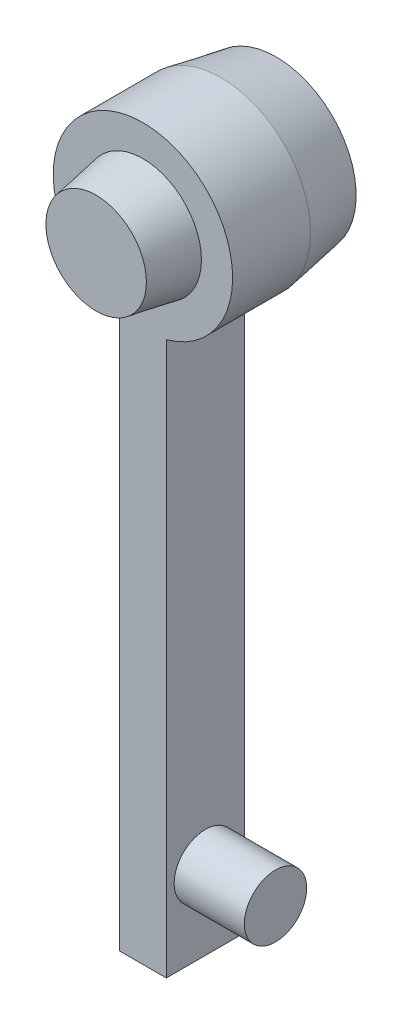
ISO-10303-21;
HEADER;
FILE_DESCRIPTION(('STEP AP214'),'2;1');
FILE_NAME('part.step','',(''),(''),'','','');
FILE_SCHEMA(('AUTOMOTIVE_DESIGN { 1 0 10303 214 1 1 1 1 }'));
ENDSEC;
DATA;
#1=APPLICATION_CONTEXT('core data for automotive mechanical design processes');
#2=APPLICATION_PROTOCOL_DEFINITION('international standard','automotive_design',2000,#1);
#3=PRODUCT_CONTEXT('',#1,'mechanical');
#4=PRODUCT('Part','Part','',(#3));
#5=PRODUCT_RELATED_PRODUCT_CATEGORY('part','',(#4));
#6=PRODUCT_DEFINITION_FORMATION('','',#4);
#7=PRODUCT_DEFINITION_CONTEXT('part definition',#1,'design');
#8=PRODUCT_DEFINITION('design','',#6,#7);
#9=PRODUCT_DEFINITION_SHAPE('','',#8);
#10=(LENGTH_UNIT() NAMED_UNIT(*) SI_UNIT(.MILLI.,.METRE.));
#11=(NAMED_UNIT(*) PLANE_ANGLE_UNIT() SI_UNIT($,.RADIAN.));
#12=(NAMED_UNIT(*) SI_UNIT($,.STERADIAN.) SOLID_ANGLE_UNIT());
#13=UNCERTAINTY_MEASURE_WITH_UNIT(LENGTH_MEASURE(1.E-05),#10,'distance_accuracy_value','');
#14=(GEOMETRIC_REPRESENTATION_CONTEXT(3) GLOBAL_UNCERTAINTY_ASSIGNED_CONTEXT((#13)) GLOBAL_UNIT_ASSIGNED_CONTEXT((#10,
#11,#12)) REPRESENTATION_CONTEXT('',''));
#15=CARTESIAN_POINT('',(0.,0.,0.));
#16=DIRECTION('',(0.,0.,1.));
#17=DIRECTION('',(1.,0.,0.));
#18=AXIS2_PLACEMENT_3D('',#15,#16,#17);
#19=CARTESIAN_POINT('',(3.00000000000001,29.8981983444127,5.));
#20=DIRECTION('',(1.,0.,0.));
#21=DIRECTION('',(0.,1.,0.));
#22=AXIS2_PLACEMENT_3D('',#19,#20,#21);
#23=PLANE('',#22);
#24=CARTESIAN_POINT('',(3.,-31.,0.));
#25=DIRECTION('',(1.,0.,0.));
#26=DIRECTION('',(0.,1.,0.));
#27=AXIS2_PLACEMENT_3D('',#24,#25,#26);
#28=CIRCLE('',#27,4.);
#29=CARTESIAN_POINT('',(3.,-27.,0.));
#30=VERTEX_POINT('',#29);
#31=EDGE_CURVE('E121',#30,#30,#28,.T.);
#32=ORIENTED_EDGE('',*,*,#31,.F.);
#33=EDGE_LOOP('',(#32));
#34=FACE_BOUND('',#33,.T.);
#35=DIRECTION('',(0.,-1.,0.));
#36=VECTOR('',#35,1.);
#37=CARTESIAN_POINT('',(3.00000000000001,29.8981983444127,-5.));
#38=LINE('',#37,#36);
#39=CARTESIAN_POINT('',(3.00000000000001,29.8981983444127,-5.));
#40=VERTEX_POINT('',#39);
#41=CARTESIAN_POINT('',(3.,-41.,-5.));
#42=VERTEX_POINT('',#41);
#43=EDGE_CURVE('E93',#40,#42,#38,.T.);
#44=ORIENTED_EDGE('',*,*,#43,.F.);
#45=DIRECTION('',(0.,0.,-1.));
#46=VECTOR('',#45,1.);
#47=CARTESIAN_POINT('',(3.00000000000001,29.8981983444127,5.));
#48=LINE('',#47,#46);
#49=CARTESIAN_POINT('',(3.00000000000001,29.8981983444127,5.));
#50=VERTEX_POINT('',#49);
#51=EDGE_CURVE('E11',#50,#40,#48,.T.);
#52=ORIENTED_EDGE('',*,*,#51,.F.);
#53=DIRECTION('',(0.,-1.,0.));
#54=VECTOR('',#53,1.);
#55=CARTESIAN_POINT('',(3.00000000000001,29.8981983444127,5.));
#56=LINE('',#55,#54);
#57=CARTESIAN_POINT('',(3.,-41.,5.));
#58=VERTEX_POINT('',#57);
#59=EDGE_CURVE('E85',#50,#58,#56,.T.);
#60=ORIENTED_EDGE('',*,*,#59,.T.);
#61=DIRECTION('',(0.,0.,-1.));
#62=VECTOR('',#61,1.);
#63=CARTESIAN_POINT('',(3.,-41.,5.));
#64=LINE('',#63,#62);
#65=EDGE_CURVE('E37',#58,#42,#64,.T.);
#66=ORIENTED_EDGE('',*,*,#65,.T.);
#67=EDGE_LOOP('',(#44,#52,#60,#66));
#68=FACE_BOUND('',#67,.T.);
#69=ADVANCED_FACE('F34',(#34,#68),#23,.T.);
#70=CARTESIAN_POINT('',(0.,41.,5.));
#71=DIRECTION('',(0.,0.,-1.));
#72=DIRECTION('',(-1.,0.,0.));
#73=AXIS2_PLACEMENT_3D('',#70,#71,#72);
#74=CYLINDRICAL_SURFACE('',#73,11.5);
#75=CARTESIAN_POINT('',(0.,41.,-5.));
#76=DIRECTION('',(0.,0.,1.));
#77=DIRECTION('',(1.,0.,0.));
#78=AXIS2_PLACEMENT_3D('',#75,#76,#77);
#79=CIRCLE('',#78,11.5);
#80=CARTESIAN_POINT('',(-3.00000000000002,29.8981983444127,-5.));
#81=VERTEX_POINT('',#80);
#82=EDGE_CURVE('E80',#40,#81,#79,.T.);
#83=ORIENTED_EDGE('',*,*,#82,.T.);
#84=DIRECTION('',(0.,0.,-1.));
#85=VECTOR('',#84,1.);
#86=CARTESIAN_POINT('',(-3.00000000000002,29.8981983444127,5.));
#87=LINE('',#86,#85);
#88=CARTESIAN_POINT('',(-3.00000000000002,29.8981983444127,5.));
#89=VERTEX_POINT('',#88);
#90=EDGE_CURVE('E43',#89,#81,#87,.T.);
#91=ORIENTED_EDGE('',*,*,#90,.F.);
#92=CARTESIAN_POINT('',(0.,41.,5.));
#93=DIRECTION('',(0.,0.,1.));
#94=DIRECTION('',(1.,0.,0.));
#95=AXIS2_PLACEMENT_3D('',#92,#93,#94);
#96=CIRCLE('',#95,11.5);
#97=EDGE_CURVE('E98',#50,#89,#96,.T.);
#98=ORIENTED_EDGE('',*,*,#97,.F.);
#99=ORIENTED_EDGE('',*,*,#51,.T.);
#100=EDGE_LOOP('',(#83,#91,#98,#99));
#101=FACE_BOUND('',#100,.T.);
#102=ADVANCED_FACE('F97',(#101),#74,.T.);
#103=CARTESIAN_POINT('',(-3.00000000000001,29.8981983444127,5.));
#104=DIRECTION('',(1.,0.,0.));
#105=DIRECTION('',(0.,1.,0.));
#106=AXIS2_PLACEMENT_3D('',#103,#104,#105);
#107=PLANE('',#106);
#108=DIRECTION('',(0.,-1.,0.));
#109=VECTOR('',#108,1.);
#110=CARTESIAN_POINT('',(-3.00000000000001,29.8981983444127,-5.));
#111=LINE('',#110,#109);
#112=CARTESIAN_POINT('',(-3.,-41.,-5.));
#113=VERTEX_POINT('',#112);
#114=EDGE_CURVE('E86',#81,#113,#111,.T.);
#115=ORIENTED_EDGE('',*,*,#114,.T.);
#116=DIRECTION('',(0.,0.,-1.));
#117=VECTOR('',#116,1.);
#118=CARTESIAN_POINT('',(-3.,-41.,5.));
#119=LINE('',#118,#117);
#120=CARTESIAN_POINT('',(-3.,-41.,5.));
#121=VERTEX_POINT('',#120);
#122=EDGE_CURVE('E66',#121,#113,#119,.T.);
#123=ORIENTED_EDGE('',*,*,#122,.F.);
#124=DIRECTION('',(0.,-1.,0.));
#125=VECTOR('',#124,1.);
#126=CARTESIAN_POINT('',(-3.00000000000001,29.8981983444127,5.));
#127=LINE('',#126,#125);
#128=EDGE_CURVE('E111',#89,#121,#127,.T.);
#129=ORIENTED_EDGE('',*,*,#128,.F.);
#130=ORIENTED_EDGE('',*,*,#90,.T.);
#131=EDGE_LOOP('',(#115,#123,#129,#130));
#132=FACE_BOUND('',#131,.T.);
#133=ADVANCED_FACE('F151',(#132),#107,.F.);
#134=CARTESIAN_POINT('',(3.,-41.,5.));
#135=DIRECTION('',(0.,-1.,0.));
#136=DIRECTION('',(0.,0.,-1.));
#137=AXIS2_PLACEMENT_3D('',#134,#135,#136);
#138=PLANE('',#137);
#139=DIRECTION('',(-1.,0.,0.));
#140=VECTOR('',#139,1.);
#141=CARTESIAN_POINT('',(3.,-41.,-5.));
#142=LINE('',#141,#140);
#143=EDGE_CURVE('E100',#42,#113,#142,.T.);
#144=ORIENTED_EDGE('',*,*,#143,.F.);
#145=ORIENTED_EDGE('',*,*,#65,.F.);
#146=DIRECTION('',(-1.,0.,0.));
#147=VECTOR('',#146,1.);
#148=CARTESIAN_POINT('',(3.,-41.,5.));
#149=LINE('',#148,#147);
#150=EDGE_CURVE('E113',#58,#121,#149,.T.);
#151=ORIENTED_EDGE('',*,*,#150,.T.);
#152=ORIENTED_EDGE('',*,*,#122,.T.);
#153=EDGE_LOOP('',(#144,#145,#151,#152));
#154=FACE_BOUND('',#153,.T.);
#155=ADVANCED_FACE('F176',(#154),#138,.T.);
#156=CARTESIAN_POINT('',(0.,41.,5.));
#157=DIRECTION('',(0.,0.,1.));
#158=DIRECTION('',(1.,0.,0.));
#159=AXIS2_PLACEMENT_3D('',#156,#157,#158);
#160=PLANE('',#159);
#161=CARTESIAN_POINT('',(0.,41.,5.));
#162=DIRECTION('',(0.,0.,1.));
#163=DIRECTION('',(1.,0.,0.));
#164=AXIS2_PLACEMENT_3D('',#161,#162,#163);
#165=CIRCLE('',#164,7.5);
#166=CARTESIAN_POINT('',(7.5,41.,5.));
#167=VERTEX_POINT('',#166);
#168=EDGE_CURVE('E105',#167,#167,#165,.T.);
#169=ORIENTED_EDGE('',*,*,#168,.F.);
#170=EDGE_LOOP('',(#169));
#171=FACE_BOUND('',#170,.T.);
#172=ORIENTED_EDGE('',*,*,#59,.F.);
#173=ORIENTED_EDGE('',*,*,#97,.T.);
#174=ORIENTED_EDGE('',*,*,#128,.T.);
#175=ORIENTED_EDGE('',*,*,#150,.F.);
#176=EDGE_LOOP('',(#172,#173,#174,#175));
#177=FACE_BOUND('',#176,.T.);
#178=ADVANCED_FACE('F174',(#171,#177),#160,.T.);
#179=CARTESIAN_POINT('',(0.,41.,-5.));
#180=DIRECTION('',(0.,0.,1.));
#181=DIRECTION('',(1.,0.,0.));
#182=AXIS2_PLACEMENT_3D('',#179,#180,#181);
#183=PLANE('',#182);
#184=CARTESIAN_POINT('',(0.,41.,-5.));
#185=DIRECTION('',(0.,0.,-1.));
#186=DIRECTION('',(-1.,0.,0.));
#187=AXIS2_PLACEMENT_3D('',#184,#185,#186);
#188=CIRCLE('',#187,11.5);
#189=EDGE_CURVE('E73',#40,#81,#188,.T.);
#190=ORIENTED_EDGE('',*,*,#189,.F.);
#191=ORIENTED_EDGE('',*,*,#43,.T.);
#192=ORIENTED_EDGE('',*,*,#143,.T.);
#193=ORIENTED_EDGE('',*,*,#114,.F.);
#194=EDGE_LOOP('',(#190,#191,#192,#193));
#195=FACE_BOUND('',#194,.T.);
#196=ADVANCED_FACE('F91',(#195),#183,.F.);
#197=CARTESIAN_POINT('',(0.,41.,5.));
#198=DIRECTION('',(0.,0.,-1.));
#199=DIRECTION('',(1.,0.,0.));
#200=AXIS2_PLACEMENT_3D('',#197,#198,#199);
#201=CONICAL_SURFACE('',#200,7.5,0.174532925199433);
#202=CARTESIAN_POINT('',(0.,41.,11.));
#203=DIRECTION('',(0.,0.,1.));
#204=DIRECTION('',(1.,0.,0.));
#205=AXIS2_PLACEMENT_3D('',#202,#203,#204);
#206=CIRCLE('',#205,6.44203811574921);
#207=CARTESIAN_POINT('',(6.44203811574921,41.,11.));
#208=VERTEX_POINT('',#207);
#209=EDGE_CURVE('E101',#208,#208,#206,.T.);
#210=ORIENTED_EDGE('',*,*,#209,.F.);
#211=EDGE_LOOP('',(#210));
#212=FACE_BOUND('',#211,.T.);
#213=ORIENTED_EDGE('',*,*,#168,.T.);
#214=EDGE_LOOP('',(#213));
#215=FACE_BOUND('',#214,.T.);
#216=ADVANCED_FACE('F166',(#212,#215),#201,.T.);
#217=CARTESIAN_POINT('',(0.,41.,11.));
#218=DIRECTION('',(0.,0.,1.));
#219=DIRECTION('',(1.,0.,0.));
#220=AXIS2_PLACEMENT_3D('',#217,#218,#219);
#221=PLANE('',#220);
#222=ORIENTED_EDGE('',*,*,#209,.T.);
#223=EDGE_LOOP('',(#222));
#224=FACE_BOUND('',#223,.T.);
#225=ADVANCED_FACE('F157',(#224),#221,.T.);
#226=CARTESIAN_POINT('',(12.,-31.,0.));
#227=DIRECTION('',(-1.,0.,0.));
#228=DIRECTION('',(0.,-1.,0.));
#229=AXIS2_PLACEMENT_3D('',#226,#227,#228);
#230=CYLINDRICAL_SURFACE('',#229,4.);
#231=CARTESIAN_POINT('',(12.,-31.,0.));
#232=DIRECTION('',(1.,0.,0.));
#233=DIRECTION('',(0.,1.,0.));
#234=AXIS2_PLACEMENT_3D('',#231,#232,#233);
#235=CIRCLE('',#234,4.);
#236=CARTESIAN_POINT('',(12.,-27.,0.));
#237=VERTEX_POINT('',#236);
#238=EDGE_CURVE('E120',#237,#237,#235,.T.);
#239=ORIENTED_EDGE('',*,*,#238,.F.);
#240=EDGE_LOOP('',(#239));
#241=FACE_BOUND('',#240,.T.);
#242=ORIENTED_EDGE('',*,*,#31,.T.);
#243=EDGE_LOOP('',(#242));
#244=FACE_BOUND('',#243,.T.);
#245=ADVANCED_FACE('F155',(#241,#244),#230,.T.);
#246=CARTESIAN_POINT('',(12.,-31.,0.));
#247=DIRECTION('',(1.,0.,0.));
#248=DIRECTION('',(0.,1.,0.));
#249=AXIS2_PLACEMENT_3D('',#246,#247,#248);
#250=PLANE('',#249);
#251=ORIENTED_EDGE('',*,*,#238,.T.);
#252=EDGE_LOOP('',(#251));
#253=FACE_BOUND('',#252,.T.);
#254=ADVANCED_FACE('F136',(#253),#250,.T.);
#255=CARTESIAN_POINT('',(0.,41.,-5.));
#256=DIRECTION('',(0.,0.,-1.));
#257=DIRECTION('',(-1.,0.,0.));
#258=AXIS2_PLACEMENT_3D('',#255,#256,#257);
#259=CONICAL_SURFACE('',#258,9.,0.174532925199433);
#260=CARTESIAN_POINT('',(0.,41.,-5.));
#261=DIRECTION('',(0.,0.,-1.));
#262=DIRECTION('',(-1.,0.,0.));
#263=AXIS2_PLACEMENT_3D('',#260,#261,#262);
#264=CIRCLE('',#263,9.);
#265=CARTESIAN_POINT('',(-9.,41.,-5.));
#266=VERTEX_POINT('',#265);
#267=EDGE_CURVE('E95',#266,#266,#264,.T.);
#268=ORIENTED_EDGE('',*,*,#267,.F.);
#269=EDGE_LOOP('',(#268));
#270=FACE_BOUND('',#269,.T.);
#271=CARTESIAN_POINT('',(0.,41.,-12.0891022745221));
#272=DIRECTION('',(0.,0.,-1.));
#273=DIRECTION('',(-1.,0.,0.));
#274=AXIS2_PLACEMENT_3D('',#271,#272,#273);
#275=CIRCLE('',#274,10.25);
#276=CARTESIAN_POINT('',(-10.25,41.,-12.0891022745221));
#277=VERTEX_POINT('',#276);
#278=EDGE_CURVE('E94',#277,#277,#275,.T.);
#279=ORIENTED_EDGE('',*,*,#278,.T.);
#280=EDGE_LOOP('',(#279));
#281=FACE_BOUND('',#280,.T.);
#282=ADVANCED_FACE('F133',(#270,#281),#259,.F.);
#283=CARTESIAN_POINT('',(0.,41.,-5.));
#284=DIRECTION('',(0.,0.,1.));
#285=DIRECTION('',(-1.,0.,0.));
#286=AXIS2_PLACEMENT_3D('',#283,#284,#285);
#287=CONICAL_SURFACE('',#286,11.5,0.174532925199433);
#288=ORIENTED_EDGE('',*,*,#278,.F.);
#289=EDGE_LOOP('',(#288));
#290=FACE_BOUND('',#289,.T.);
#291=ORIENTED_EDGE('',*,*,#189,.T.);
#292=ORIENTED_EDGE('',*,*,#82,.F.);
#293=EDGE_LOOP('',(#291,#292));
#294=FACE_BOUND('',#293,.T.);
#295=ADVANCED_FACE('F81',(#290,#294),#287,.T.);
#296=ORIENTED_EDGE('',*,*,#267,.T.);
#297=EDGE_LOOP('',(#296));
#298=FACE_BOUND('',#297,.T.);
#299=ADVANCED_FACE('F131',(#298),#183,.F.);
#300=CLOSED_SHELL('',(#69,#102,#133,#155,#178,#196,#216,#225,#245,#254,#282,#295,#299));
#301=MANIFOLD_SOLID_BREP('B2',#300);
#302=ADVANCED_BREP_SHAPE_REPRESENTATION('',(#18,#301),#14);
#303=SHAPE_DEFINITION_REPRESENTATION(#9,#302);
ENDSEC;
END-ISO-10303-21;
